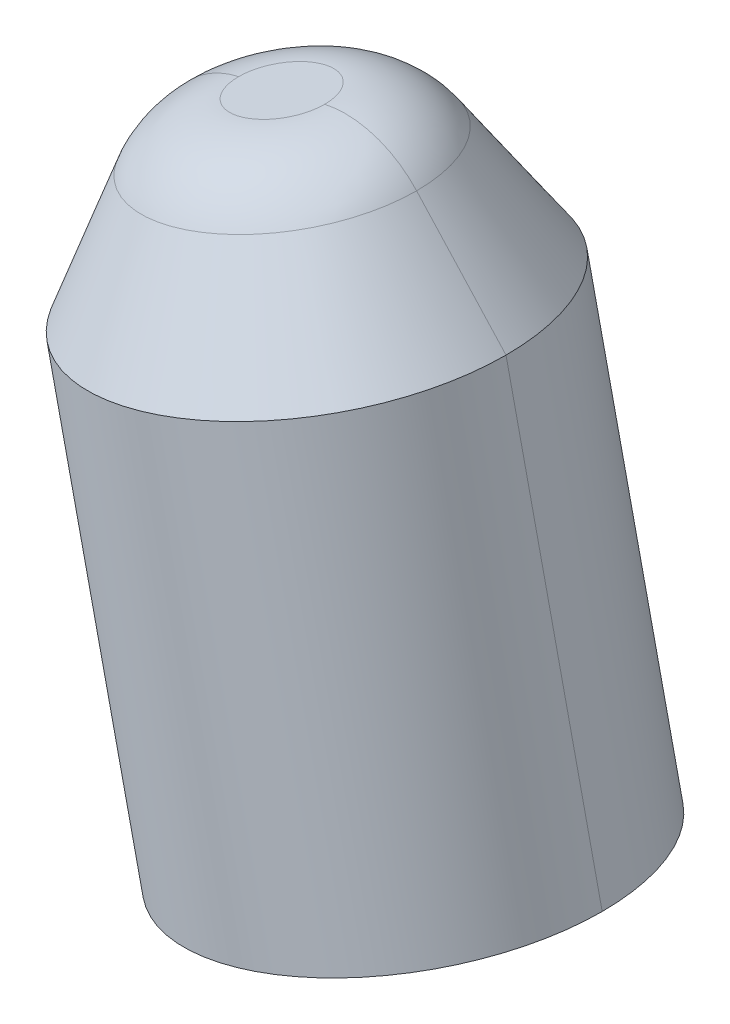
ISO-10303-21;
HEADER;
FILE_DESCRIPTION(('STEP AP214'),'2;1');
FILE_NAME('part.step','',(''),(''),'','','');
FILE_SCHEMA(('AUTOMOTIVE_DESIGN { 1 0 10303 214 1 1 1 1 }'));
ENDSEC;
DATA;
#1=APPLICATION_CONTEXT('core data for automotive mechanical design processes');
#2=APPLICATION_PROTOCOL_DEFINITION('international standard','automotive_design',2000,#1);
#3=PRODUCT_CONTEXT('',#1,'mechanical');
#4=PRODUCT('Part','Part','',(#3));
#5=PRODUCT_RELATED_PRODUCT_CATEGORY('part','',(#4));
#6=PRODUCT_DEFINITION_FORMATION('','',#4);
#7=PRODUCT_DEFINITION_CONTEXT('part definition',#1,'design');
#8=PRODUCT_DEFINITION('design','',#6,#7);
#9=PRODUCT_DEFINITION_SHAPE('','',#8);
#10=(LENGTH_UNIT() NAMED_UNIT(*) SI_UNIT(.MILLI.,.METRE.));
#11=(NAMED_UNIT(*) PLANE_ANGLE_UNIT() SI_UNIT($,.RADIAN.));
#12=(NAMED_UNIT(*) SI_UNIT($,.STERADIAN.) SOLID_ANGLE_UNIT());
#13=UNCERTAINTY_MEASURE_WITH_UNIT(LENGTH_MEASURE(1.E-05),#10,'distance_accuracy_value','');
#14=(GEOMETRIC_REPRESENTATION_CONTEXT(3) GLOBAL_UNCERTAINTY_ASSIGNED_CONTEXT((#13)) GLOBAL_UNIT_ASSIGNED_CONTEXT((#10,
#11,#12)) REPRESENTATION_CONTEXT('',''));
#15=CARTESIAN_POINT('',(0.,0.,0.));
#16=DIRECTION('',(0.,0.,1.));
#17=DIRECTION('',(1.,0.,0.));
#18=AXIS2_PLACEMENT_3D('',#15,#16,#17);
#19=CARTESIAN_POINT('',(-2.4063307153215,7.04425642022391,0.));
#20=DIRECTION('',(-0.21643961393812,0.97629600711993,0.));
#21=DIRECTION('',(0.,0.,-1.));
#22=AXIS2_PLACEMENT_3D('',#19,#20,#21);
#23=CYLINDRICAL_SURFACE('',#22,2.55270000000003);
#24=CARTESIAN_POINT('',(-2.40633071532149,7.04425642022385,0.));
#25=DIRECTION('',(0.21643961393812,-0.97629600711993,0.));
#26=DIRECTION('',(0.97629600711993,0.21643961393812,0.));
#27=AXIS2_PLACEMENT_3D('',#24,#25,#26);
#28=CIRCLE('',#27,2.5527);
#29=CARTESIAN_POINT('',(0.0858601020535576,7.59676182272369,0.));
#30=VERTEX_POINT('',#29);
#31=CARTESIAN_POINT('',(-4.89852153269656,6.49175101772401,0.));
#32=VERTEX_POINT('',#31);
#33=EDGE_CURVE('E11',#30,#32,#28,.T.);
#34=ORIENTED_EDGE('',*,*,#33,.F.);
#35=CARTESIAN_POINT('',(0.0858601020535805,7.5967618227237,0.));
#36=DIRECTION('',(-0.21643961393812,0.97629600711993,0.));
#37=VECTOR('',#36,1.);
#38=LINE('',#35,#37);
#39=CARTESIAN_POINT('',(-1.1814945263813,13.31342912236,0.));
#40=VERTEX_POINT('',#39);
#41=EDGE_CURVE('E25',#30,#40,#38,.T.);
#42=ORIENTED_EDGE('',*,*,#41,.T.);
#43=CARTESIAN_POINT('',(-3.6736853437564,12.7609237198601,0.));
#44=DIRECTION('',(0.21643961393812,-0.97629600711993,0.));
#45=DIRECTION('',(0.97629600711993,0.21643961393812,0.));
#46=AXIS2_PLACEMENT_3D('',#43,#44,#45);
#47=CIRCLE('',#46,2.55270000000005);
#48=CARTESIAN_POINT('',(-6.16587616113146,12.2084183173603,0.));
#49=VERTEX_POINT('',#48);
#50=EDGE_CURVE('E222',#40,#49,#47,.T.);
#51=ORIENTED_EDGE('',*,*,#50,.T.);
#52=CARTESIAN_POINT('',(-4.89852153269656,6.49175101772401,0.));
#53=DIRECTION('',(-0.21643961393812,0.976296007119929,0.));
#54=VECTOR('',#53,1.);
#55=LINE('',#52,#54);
#56=EDGE_CURVE('E210',#32,#49,#55,.T.);
#57=ORIENTED_EDGE('',*,*,#56,.F.);
#58=EDGE_LOOP('',(#34,#42,#51,#57));
#59=FACE_BOUND('',#58,.T.);
#60=ADVANCED_FACE('F16',(#59),#23,.T.);
#61=CARTESIAN_POINT('',(-2.4063307153215,7.04425642022391,0.));
#62=DIRECTION('',(-0.21643961393812,0.97629600711993,0.));
#63=DIRECTION('',(0.,0.,1.));
#64=AXIS2_PLACEMENT_3D('',#61,#62,#63);
#65=CYLINDRICAL_SURFACE('',#64,2.55270000000003);
#66=CARTESIAN_POINT('',(-3.6736853437564,12.7609237198601,0.));
#67=DIRECTION('',(0.21643961393812,-0.97629600711993,0.));
#68=DIRECTION('',(0.97629600711993,0.21643961393812,0.));
#69=AXIS2_PLACEMENT_3D('',#66,#67,#68);
#70=CIRCLE('',#69,2.55270000000005);
#71=EDGE_CURVE('E208',#49,#40,#70,.T.);
#72=ORIENTED_EDGE('',*,*,#71,.T.);
#73=ORIENTED_EDGE('',*,*,#41,.F.);
#74=CARTESIAN_POINT('',(-2.40633071532149,7.04425642022385,0.));
#75=DIRECTION('',(0.21643961393812,-0.97629600711993,0.));
#76=DIRECTION('',(0.97629600711993,0.21643961393812,0.));
#77=AXIS2_PLACEMENT_3D('',#74,#75,#76);
#78=CIRCLE('',#77,2.5527);
#79=EDGE_CURVE('E176',#32,#30,#78,.T.);
#80=ORIENTED_EDGE('',*,*,#79,.F.);
#81=ORIENTED_EDGE('',*,*,#56,.T.);
#82=EDGE_LOOP('',(#72,#73,#80,#81));
#83=FACE_BOUND('',#82,.T.);
#84=ADVANCED_FACE('F184',(#83),#65,.T.);
#85=CARTESIAN_POINT('',(0.0858601020535533,7.59676182272372,0.));
#86=DIRECTION('',(-0.21643961393812,0.97629600711993,0.));
#87=DIRECTION('',(-0.97629600711993,-0.21643961393812,0.));
#88=AXIS2_PLACEMENT_3D('',#85,#86,#87);
#89=PLANE('',#88);
#90=ORIENTED_EDGE('',*,*,#33,.T.);
#91=ORIENTED_EDGE('',*,*,#79,.T.);
#92=EDGE_LOOP('',(#90,#91));
#93=FACE_BOUND('',#92,.T.);
#94=ADVANCED_FACE('F162',(#93),#89,.F.);
#95=CARTESIAN_POINT('',(-4.0006249115897,14.2356528086693,0.));
#96=DIRECTION('',(0.216439613938121,-0.976296007119929,0.));
#97=DIRECTION('',(0.,0.,1.));
#98=AXIS2_PLACEMENT_3D('',#95,#96,#97);
#99=CONICAL_SURFACE('',#98,1.68059232958458,0.523598775598057);
#100=CARTESIAN_POINT('',(-4.0006249115897,14.2356528086693,0.));
#101=DIRECTION('',(0.21643961393812,-0.97629600711993,0.));
#102=DIRECTION('',(0.97629600711993,0.21643961393812,0.));
#103=AXIS2_PLACEMENT_3D('',#100,#101,#102);
#104=CIRCLE('',#103,1.68059232958458);
#105=CARTESIAN_POINT('',(-5.6413804925595,13.8719060536667,0.));
#106=VERTEX_POINT('',#105);
#107=CARTESIAN_POINT('',(-2.3598693306199,14.599399563672,0.));
#108=VERTEX_POINT('',#107);
#109=EDGE_CURVE('E72',#106,#108,#104,.T.);
#110=ORIENTED_EDGE('',*,*,#109,.T.);
#111=CARTESIAN_POINT('',(-2.35986933061989,14.599399563672,0.));
#112=DIRECTION('',(0.675590207615496,-0.737277336810275,0.));
#113=VECTOR('',#112,1.);
#114=LINE('',#111,#113);
#115=EDGE_CURVE('E148',#108,#40,#114,.T.);
#116=ORIENTED_EDGE('',*,*,#115,.T.);
#117=ORIENTED_EDGE('',*,*,#71,.F.);
#118=CARTESIAN_POINT('',(-5.64138049255951,13.8719060536667,0.));
#119=DIRECTION('',(-0.300705799504025,-0.953716950748305,0.));
#120=VECTOR('',#119,1.);
#121=LINE('',#118,#120);
#122=EDGE_CURVE('E132',#106,#49,#121,.T.);
#123=ORIENTED_EDGE('',*,*,#122,.F.);
#124=EDGE_LOOP('',(#110,#116,#117,#123));
#125=FACE_BOUND('',#124,.T.);
#126=ADVANCED_FACE('F153',(#125),#99,.T.);
#127=CARTESIAN_POINT('',(-4.0006249115897,14.2356528086693,0.));
#128=DIRECTION('',(0.216439613938121,-0.976296007119929,0.));
#129=DIRECTION('',(0.,0.,-1.));
#130=AXIS2_PLACEMENT_3D('',#127,#128,#129);
#131=CONICAL_SURFACE('',#130,1.68059232958458,0.523598775598057);
#132=ORIENTED_EDGE('',*,*,#50,.F.);
#133=ORIENTED_EDGE('',*,*,#115,.F.);
#134=CARTESIAN_POINT('',(-4.0006249115897,14.2356528086693,0.));
#135=DIRECTION('',(0.21643961393812,-0.97629600711993,0.));
#136=DIRECTION('',(0.97629600711993,0.21643961393812,0.));
#137=AXIS2_PLACEMENT_3D('',#134,#135,#136);
#138=CIRCLE('',#137,1.68059232958458);
#139=EDGE_CURVE('E133',#108,#106,#138,.T.);
#140=ORIENTED_EDGE('',*,*,#139,.T.);
#141=ORIENTED_EDGE('',*,*,#122,.T.);
#142=EDGE_LOOP('',(#132,#133,#140,#141));
#143=FACE_BOUND('',#142,.T.);
#144=ADVANCED_FACE('F95',(#143),#131,.T.);
#145=CARTESIAN_POINT('',(-2.3598693306199,14.599399563672,0.));
#146=CARTESIAN_POINT('',(-2.3598693306199,14.599399563672,3.36118465916915));
#147=CARTESIAN_POINT('',(-5.6413804925595,13.8719060536667,3.36118465916915));
#148=CARTESIAN_POINT('',(-5.6413804925595,13.8719060536667,0.));
#149=CARTESIAN_POINT('',(-2.67391896735995,14.9421246020036,0.));
#150=CARTESIAN_POINT('',(-2.67391896735995,14.9421246020036,2.89633239636243));
#151=CARTESIAN_POINT('',(-5.50159672122069,14.3152435362985,2.89633239636243));
#152=CARTESIAN_POINT('',(-5.50159672122069,14.3152435362985,0.));
#153=CARTESIAN_POINT('',(-3.1172564499919,15.081908373342,0.));
#154=CARTESIAN_POINT('',(-3.1172564499919,15.081908373342,2.09118465916869));
#155=CARTESIAN_POINT('',(-5.15887168288875,14.6292931730382,2.09118465916869));
#156=CARTESIAN_POINT('',(-5.15887168288875,14.6292931730382,0.));
#157=CARTESIAN_POINT('',(-3.57108985807021,14.981295929042,0.));
#158=CARTESIAN_POINT('',(-3.57108985807021,14.981295929042,1.16148013355642));
#159=CARTESIAN_POINT('',(-4.70503827481045,14.7299056173383,1.16148013355642));
#160=CARTESIAN_POINT('',(-4.70503827481045,14.7299056173383,0.));
#161=(BOUNDED_SURFACE() B_SPLINE_SURFACE(3,3,((#145,#146,#147,#148),(#149,#150,#151,#152),(#153,
#154,#155,#156),(#157,#158,#159,#160)),.UNSPECIFIED.,.F.,.F.,
.F.) B_SPLINE_SURFACE_WITH_KNOTS((4,4),(4,4),(0.,1.),(-7.16555536854993,-4.77703691236837),
.UNSPECIFIED.) GEOMETRIC_REPRESENTATION_ITEM() RATIONAL_B_SPLINE_SURFACE(((1.,0.333333333333333,
0.333333333333333,1.),(0.910683602523098,0.303561200841033,0.303561200841033,0.910683602523098),
(0.910683602523098,0.303561200841033,0.303561200841033,0.910683602523098),(1.,0.333333333333333,
0.333333333333333,1.))) REPRESENTATION_ITEM('') SURFACE());
#162=CARTESIAN_POINT('',(-2.3598693306199,14.599399563672,0.));
#163=CARTESIAN_POINT('',(-2.67391896735995,14.9421246020036,0.));
#164=CARTESIAN_POINT('',(-3.1172564499919,15.081908373342,0.));
#165=CARTESIAN_POINT('',(-3.57108985807021,14.981295929042,0.));
#166=(BOUNDED_CURVE() B_SPLINE_CURVE(3,(#162,#163,#164,#165),.UNSPECIFIED.,.F.,
.F.) B_SPLINE_CURVE_WITH_KNOTS((4,4),(0.,1.),
.UNSPECIFIED.) CURVE() GEOMETRIC_REPRESENTATION_ITEM() RATIONAL_B_SPLINE_CURVE((1.,
0.910683602523098,0.910683602523098,1.)) REPRESENTATION_ITEM(''));
#167=CARTESIAN_POINT('',(-3.57108985807021,14.981295929042,0.));
#168=VERTEX_POINT('',#167);
#169=EDGE_CURVE('E62',#108,#168,#166,.T.);
#170=CARTESIAN_POINT('',(-4.13806406644033,14.8556007731901,0.));
#171=DIRECTION('',(0.216439613938121,-0.976296007119929,0.));
#172=DIRECTION('',(0.976296007119929,0.216439613938121,0.));
#173=AXIS2_PLACEMENT_3D('',#170,#171,#172);
#174=CIRCLE('',#173,0.580740066778211);
#175=CARTESIAN_POINT('',(-4.70503827481044,14.7299056173382,0.));
#176=VERTEX_POINT('',#175);
#177=EDGE_CURVE('E54',#168,#176,#174,.T.);
#178=CARTESIAN_POINT('',(-5.6413804925595,13.8719060536667,0.));
#179=CARTESIAN_POINT('',(-5.50159672122069,14.3152435362985,0.));
#180=CARTESIAN_POINT('',(-5.15887168288875,14.6292931730382,0.));
#181=CARTESIAN_POINT('',(-4.70503827481045,14.7299056173383,0.));
#182=(BOUNDED_CURVE() B_SPLINE_CURVE(3,(#178,#179,#180,#181),.UNSPECIFIED.,.F.,
.F.) B_SPLINE_CURVE_WITH_KNOTS((4,4),(0.,1.),
.UNSPECIFIED.) CURVE() GEOMETRIC_REPRESENTATION_ITEM() RATIONAL_B_SPLINE_CURVE((1.,
0.910683602523098,0.910683602523098,1.)) REPRESENTATION_ITEM(''));
#183=EDGE_CURVE('E58',#106,#176,#182,.T.);
#184=ORIENTED_EDGE('',*,*,#139,.F.);
#185=ORIENTED_EDGE('',*,*,#169,.T.);
#186=ORIENTED_EDGE('',*,*,#177,.T.);
#187=ORIENTED_EDGE('',*,*,#183,.F.);
#188=EDGE_LOOP('',(#184,#185,#186,#187));
#189=FACE_BOUND('',#188,.T.);
#190=ADVANCED_FACE('F57',(#189),#161,.T.);
#191=CARTESIAN_POINT('',(-5.6413804925595,13.8719060536667,0.));
#192=CARTESIAN_POINT('',(-5.6413804925595,13.8719060536667,-3.36118465916915));
#193=CARTESIAN_POINT('',(-2.3598693306199,14.599399563672,-3.36118465916915));
#194=CARTESIAN_POINT('',(-2.3598693306199,14.599399563672,0.));
#195=CARTESIAN_POINT('',(-5.50159672122069,14.3152435362985,0.));
#196=CARTESIAN_POINT('',(-5.50159672122069,14.3152435362985,-2.89633239636243));
#197=CARTESIAN_POINT('',(-2.67391896735995,14.9421246020036,-2.89633239636243));
#198=CARTESIAN_POINT('',(-2.67391896735995,14.9421246020036,0.));
#199=CARTESIAN_POINT('',(-5.15887168288875,14.6292931730382,0.));
#200=CARTESIAN_POINT('',(-5.15887168288875,14.6292931730382,-2.09118465916869));
#201=CARTESIAN_POINT('',(-3.1172564499919,15.081908373342,-2.09118465916869));
#202=CARTESIAN_POINT('',(-3.1172564499919,15.081908373342,0.));
#203=CARTESIAN_POINT('',(-4.70503827481045,14.7299056173383,0.));
#204=CARTESIAN_POINT('',(-4.70503827481045,14.7299056173383,-1.16148013355642));
#205=CARTESIAN_POINT('',(-3.57108985807021,14.981295929042,-1.16148013355642));
#206=CARTESIAN_POINT('',(-3.57108985807021,14.981295929042,0.));
#207=(BOUNDED_SURFACE() B_SPLINE_SURFACE(3,3,((#191,#192,#193,#194),(#195,#196,#197,#198),(#199,
#200,#201,#202),(#203,#204,#205,#206)),.UNSPECIFIED.,.F.,.F.,
.F.) B_SPLINE_SURFACE_WITH_KNOTS((4,4),(4,4),(0.,1.),(-4.77703691236839,-2.38851845618684),
.UNSPECIFIED.) GEOMETRIC_REPRESENTATION_ITEM() RATIONAL_B_SPLINE_SURFACE(((1.,0.333333333333333,
0.333333333333333,1.),(0.910683602523098,0.303561200841033,0.303561200841033,0.910683602523098),
(0.910683602523098,0.303561200841033,0.303561200841033,0.910683602523098),(1.,0.333333333333333,
0.333333333333333,1.))) REPRESENTATION_ITEM('') SURFACE());
#208=CARTESIAN_POINT('',(-4.13806406644033,14.8556007731901,0.));
#209=DIRECTION('',(0.216439613938121,-0.976296007119929,0.));
#210=DIRECTION('',(0.976296007119929,0.216439613938121,0.));
#211=AXIS2_PLACEMENT_3D('',#208,#209,#210);
#212=CIRCLE('',#211,0.580740066778211);
#213=EDGE_CURVE('E71',#176,#168,#212,.T.);
#214=ORIENTED_EDGE('',*,*,#213,.T.);
#215=ORIENTED_EDGE('',*,*,#169,.F.);
#216=ORIENTED_EDGE('',*,*,#109,.F.);
#217=ORIENTED_EDGE('',*,*,#183,.T.);
#218=EDGE_LOOP('',(#214,#215,#216,#217));
#219=FACE_BOUND('',#218,.T.);
#220=ADVANCED_FACE('F70',(#219),#207,.T.);
#221=CARTESIAN_POINT('',(-4.1380640664403,14.8556007731901,0.));
#222=DIRECTION('',(0.21643961393812,-0.97629600711993,0.));
#223=DIRECTION('',(0.97629600711993,0.21643961393812,0.));
#224=AXIS2_PLACEMENT_3D('',#221,#222,#223);
#225=PLANE('',#224);
#226=ORIENTED_EDGE('',*,*,#177,.F.);
#227=ORIENTED_EDGE('',*,*,#213,.F.);
#228=EDGE_LOOP('',(#226,#227));
#229=FACE_BOUND('',#228,.T.);
#230=ADVANCED_FACE('F75',(#229),#225,.F.);
#231=CLOSED_SHELL('',(#60,#84,#94,#126,#144,#190,#220,#230));
#232=MANIFOLD_SOLID_BREP('B1',#231);
#233=ADVANCED_BREP_SHAPE_REPRESENTATION('',(#18,#232),#14);
#234=SHAPE_DEFINITION_REPRESENTATION(#9,#233);
ENDSEC;
END-ISO-10303-21;
